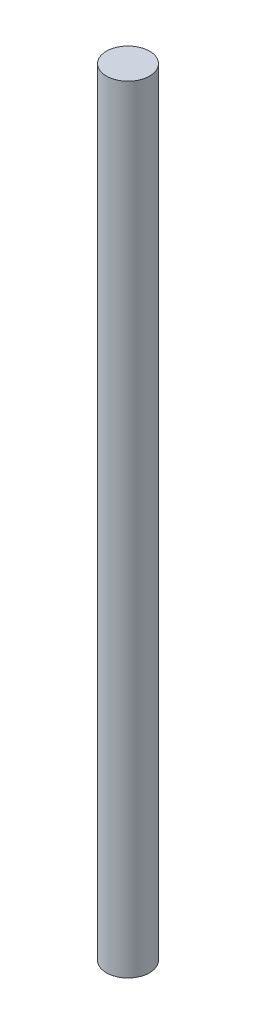
ISO-10303-21;
HEADER;
FILE_DESCRIPTION(('STEP AP214'),'2;1');
FILE_NAME('part.step','',(''),(''),'','','');
FILE_SCHEMA(('AUTOMOTIVE_DESIGN { 1 0 10303 214 1 1 1 1 }'));
ENDSEC;
DATA;
#1=APPLICATION_CONTEXT('core data for automotive mechanical design processes');
#2=APPLICATION_PROTOCOL_DEFINITION('international standard','automotive_design',2000,#1);
#3=PRODUCT_CONTEXT('',#1,'mechanical');
#4=PRODUCT('Part','Part','',(#3));
#5=PRODUCT_RELATED_PRODUCT_CATEGORY('part','',(#4));
#6=PRODUCT_DEFINITION_FORMATION('','',#4);
#7=PRODUCT_DEFINITION_CONTEXT('part definition',#1,'design');
#8=PRODUCT_DEFINITION('design','',#6,#7);
#9=PRODUCT_DEFINITION_SHAPE('','',#8);
#10=(LENGTH_UNIT() NAMED_UNIT(*) SI_UNIT(.MILLI.,.METRE.));
#11=(NAMED_UNIT(*) PLANE_ANGLE_UNIT() SI_UNIT($,.RADIAN.));
#12=(NAMED_UNIT(*) SI_UNIT($,.STERADIAN.) SOLID_ANGLE_UNIT());
#13=UNCERTAINTY_MEASURE_WITH_UNIT(LENGTH_MEASURE(1.E-05),#10,'distance_accuracy_value','');
#14=(GEOMETRIC_REPRESENTATION_CONTEXT(3) GLOBAL_UNCERTAINTY_ASSIGNED_CONTEXT((#13)) GLOBAL_UNIT_ASSIGNED_CONTEXT((#10,
#11,#12)) REPRESENTATION_CONTEXT('',''));
#15=CARTESIAN_POINT('',(0.,0.,0.));
#16=DIRECTION('',(0.,0.,1.));
#17=DIRECTION('',(1.,0.,0.));
#18=AXIS2_PLACEMENT_3D('',#15,#16,#17);
#19=CARTESIAN_POINT('',(0.,108.,0.));
#20=DIRECTION('',(0.,-1.,0.));
#21=DIRECTION('',(0.,0.,-1.));
#22=AXIS2_PLACEMENT_3D('',#19,#20,#21);
#23=CYLINDRICAL_SURFACE('',#22,3.);
#24=CARTESIAN_POINT('',(0.,108.,0.));
#25=DIRECTION('',(0.,1.,0.));
#26=DIRECTION('',(0.,0.,1.));
#27=AXIS2_PLACEMENT_3D('',#24,#25,#26);
#28=CIRCLE('',#27,3.);
#29=CARTESIAN_POINT('',(0.,108.,3.));
#30=VERTEX_POINT('',#29);
#31=EDGE_CURVE('E10',#30,#30,#28,.T.);
#32=ORIENTED_EDGE('',*,*,#31,.F.);
#33=EDGE_LOOP('',(#32));
#34=FACE_BOUND('',#33,.T.);
#35=CARTESIAN_POINT('',(0.,0.,0.));
#36=DIRECTION('',(0.,1.,0.));
#37=DIRECTION('',(0.,0.,1.));
#38=AXIS2_PLACEMENT_3D('',#35,#36,#37);
#39=CIRCLE('',#38,3.);
#40=CARTESIAN_POINT('',(0.,0.,3.));
#41=VERTEX_POINT('',#40);
#42=EDGE_CURVE('E40',#41,#41,#39,.T.);
#43=ORIENTED_EDGE('',*,*,#42,.T.);
#44=EDGE_LOOP('',(#43));
#45=FACE_BOUND('',#44,.T.);
#46=ADVANCED_FACE('F37',(#34,#45),#23,.T.);
#47=CARTESIAN_POINT('',(0.,108.,0.));
#48=DIRECTION('',(0.,1.,0.));
#49=DIRECTION('',(0.,0.,1.));
#50=AXIS2_PLACEMENT_3D('',#47,#48,#49);
#51=PLANE('',#50);
#52=ORIENTED_EDGE('',*,*,#31,.T.);
#53=EDGE_LOOP('',(#52));
#54=FACE_BOUND('',#53,.T.);
#55=ADVANCED_FACE('F54',(#54),#51,.T.);
#56=CARTESIAN_POINT('',(0.,0.,0.));
#57=DIRECTION('',(0.,1.,0.));
#58=DIRECTION('',(0.,0.,1.));
#59=AXIS2_PLACEMENT_3D('',#56,#57,#58);
#60=PLANE('',#59);
#61=ORIENTED_EDGE('',*,*,#42,.F.);
#62=EDGE_LOOP('',(#61));
#63=FACE_BOUND('',#62,.T.);
#64=ADVANCED_FACE('F52',(#63),#60,.F.);
#65=CLOSED_SHELL('',(#46,#55,#64));
#66=MANIFOLD_SOLID_BREP('B2',#65);
#67=ADVANCED_BREP_SHAPE_REPRESENTATION('',(#18,#66),#14);
#68=SHAPE_DEFINITION_REPRESENTATION(#9,#67);
ENDSEC;
END-ISO-10303-21;
